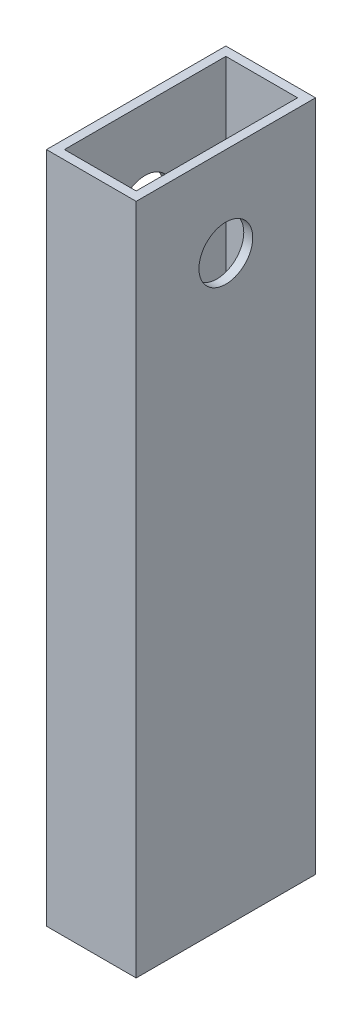
ISO-10303-21;
HEADER;
FILE_DESCRIPTION(('STEP AP214'),'2;1');
FILE_NAME('part.step','',(''),(''),'','','');
FILE_SCHEMA(('AUTOMOTIVE_DESIGN { 1 0 10303 214 1 1 1 1 }'));
ENDSEC;
DATA;
#1=APPLICATION_CONTEXT('core data for automotive mechanical design processes');
#2=APPLICATION_PROTOCOL_DEFINITION('international standard','automotive_design',2000,#1);
#3=PRODUCT_CONTEXT('',#1,'mechanical');
#4=PRODUCT('Part','Part','',(#3));
#5=PRODUCT_RELATED_PRODUCT_CATEGORY('part','',(#4));
#6=PRODUCT_DEFINITION_FORMATION('','',#4);
#7=PRODUCT_DEFINITION_CONTEXT('part definition',#1,'design');
#8=PRODUCT_DEFINITION('design','',#6,#7);
#9=PRODUCT_DEFINITION_SHAPE('','',#8);
#10=(LENGTH_UNIT() NAMED_UNIT(*) SI_UNIT(.MILLI.,.METRE.));
#11=(NAMED_UNIT(*) PLANE_ANGLE_UNIT() SI_UNIT($,.RADIAN.));
#12=(NAMED_UNIT(*) SI_UNIT($,.STERADIAN.) SOLID_ANGLE_UNIT());
#13=UNCERTAINTY_MEASURE_WITH_UNIT(LENGTH_MEASURE(1.E-05),#10,'distance_accuracy_value','');
#14=(GEOMETRIC_REPRESENTATION_CONTEXT(3) GLOBAL_UNCERTAINTY_ASSIGNED_CONTEXT((#13)) GLOBAL_UNIT_ASSIGNED_CONTEXT((#10,
#11,#12)) REPRESENTATION_CONTEXT('',''));
#15=CARTESIAN_POINT('',(0.,0.,0.));
#16=DIRECTION('',(0.,0.,1.));
#17=DIRECTION('',(1.,0.,0.));
#18=AXIS2_PLACEMENT_3D('',#15,#16,#17);
#19=CARTESIAN_POINT('',(0.,75.,0.));
#20=DIRECTION('',(0.,-1.,0.));
#21=DIRECTION('',(0.,0.,-1.));
#22=AXIS2_PLACEMENT_3D('',#19,#20,#21);
#23=PLANE('',#22);
#24=DIRECTION('',(0.,0.,-1.));
#25=VECTOR('',#24,1.);
#26=CARTESIAN_POINT('',(5.,75.,10.));
#27=LINE('',#26,#25);
#28=CARTESIAN_POINT('',(5.,75.,10.));
#29=VERTEX_POINT('',#28);
#30=CARTESIAN_POINT('',(5.,75.,-9.99999999999999));
#31=VERTEX_POINT('',#30);
#32=EDGE_CURVE('E141',#29,#31,#27,.T.);
#33=ORIENTED_EDGE('',*,*,#32,.T.);
#34=DIRECTION('',(-1.,0.,0.));
#35=VECTOR('',#34,1.);
#36=CARTESIAN_POINT('',(-5.,75.,-9.99999999999999));
#37=LINE('',#36,#35);
#38=CARTESIAN_POINT('',(-5.,75.,-9.99999999999999));
#39=VERTEX_POINT('',#38);
#40=EDGE_CURVE('E144',#31,#39,#37,.T.);
#41=ORIENTED_EDGE('',*,*,#40,.T.);
#42=DIRECTION('',(0.,0.,1.));
#43=VECTOR('',#42,1.);
#44=CARTESIAN_POINT('',(-5.,75.,10.));
#45=LINE('',#44,#43);
#46=CARTESIAN_POINT('',(-5.,75.,10.));
#47=VERTEX_POINT('',#46);
#48=EDGE_CURVE('E147',#39,#47,#45,.T.);
#49=ORIENTED_EDGE('',*,*,#48,.T.);
#50=DIRECTION('',(1.,0.,0.));
#51=VECTOR('',#50,1.);
#52=CARTESIAN_POINT('',(-5.,75.,10.));
#53=LINE('',#52,#51);
#54=EDGE_CURVE('E149',#47,#29,#53,.T.);
#55=ORIENTED_EDGE('',*,*,#54,.T.);
#56=EDGE_LOOP('',(#33,#41,#49,#55));
#57=FACE_BOUND('',#56,.T.);
#58=DIRECTION('',(0.,0.,1.));
#59=VECTOR('',#58,1.);
#60=CARTESIAN_POINT('',(-4.,75.,9.00000000000001));
#61=LINE('',#60,#59);
#62=CARTESIAN_POINT('',(-4.,75.,-8.99999999999999));
#63=VERTEX_POINT('',#62);
#64=CARTESIAN_POINT('',(-4.,75.,9.00000000000001));
#65=VERTEX_POINT('',#64);
#66=EDGE_CURVE('E103',#63,#65,#61,.T.);
#67=ORIENTED_EDGE('',*,*,#66,.F.);
#68=DIRECTION('',(-1.,0.,0.));
#69=VECTOR('',#68,1.);
#70=CARTESIAN_POINT('',(-4.,75.,-8.99999999999999));
#71=LINE('',#70,#69);
#72=CARTESIAN_POINT('',(4.,75.,-8.99999999999999));
#73=VERTEX_POINT('',#72);
#74=EDGE_CURVE('E125',#73,#63,#71,.T.);
#75=ORIENTED_EDGE('',*,*,#74,.F.);
#76=DIRECTION('',(0.,0.,-1.));
#77=VECTOR('',#76,1.);
#78=CARTESIAN_POINT('',(4.,75.,9.00000000000001));
#79=LINE('',#78,#77);
#80=CARTESIAN_POINT('',(4.,75.,9.00000000000001));
#81=VERTEX_POINT('',#80);
#82=EDGE_CURVE('E123',#81,#73,#79,.T.);
#83=ORIENTED_EDGE('',*,*,#82,.F.);
#84=DIRECTION('',(1.,0.,0.));
#85=VECTOR('',#84,1.);
#86=CARTESIAN_POINT('',(-4.,75.,9.00000000000001));
#87=LINE('',#86,#85);
#88=EDGE_CURVE('E111',#65,#81,#87,.T.);
#89=ORIENTED_EDGE('',*,*,#88,.F.);
#90=EDGE_LOOP('',(#67,#75,#83,#89));
#91=FACE_BOUND('',#90,.T.);
#92=ADVANCED_FACE('F37',(#57,#91),#23,.F.);
#93=CARTESIAN_POINT('',(0.,0.,0.));
#94=DIRECTION('',(0.,-1.,0.));
#95=DIRECTION('',(0.,0.,-1.));
#96=AXIS2_PLACEMENT_3D('',#93,#94,#95);
#97=PLANE('',#96);
#98=DIRECTION('',(0.,0.,-1.));
#99=VECTOR('',#98,1.);
#100=CARTESIAN_POINT('',(5.,0.,10.));
#101=LINE('',#100,#99);
#102=CARTESIAN_POINT('',(5.,0.,10.));
#103=VERTEX_POINT('',#102);
#104=CARTESIAN_POINT('',(5.,0.,-9.99999999999999));
#105=VERTEX_POINT('',#104);
#106=EDGE_CURVE('E119',#103,#105,#101,.T.);
#107=ORIENTED_EDGE('',*,*,#106,.F.);
#108=DIRECTION('',(1.,0.,0.));
#109=VECTOR('',#108,1.);
#110=CARTESIAN_POINT('',(-5.,0.,10.));
#111=LINE('',#110,#109);
#112=CARTESIAN_POINT('',(-5.,0.,10.));
#113=VERTEX_POINT('',#112);
#114=EDGE_CURVE('E145',#113,#103,#111,.T.);
#115=ORIENTED_EDGE('',*,*,#114,.F.);
#116=DIRECTION('',(0.,0.,1.));
#117=VECTOR('',#116,1.);
#118=CARTESIAN_POINT('',(-5.,0.,10.));
#119=LINE('',#118,#117);
#120=CARTESIAN_POINT('',(-5.,0.,-9.99999999999999));
#121=VERTEX_POINT('',#120);
#122=EDGE_CURVE('E156',#121,#113,#119,.T.);
#123=ORIENTED_EDGE('',*,*,#122,.F.);
#124=DIRECTION('',(-1.,0.,0.));
#125=VECTOR('',#124,1.);
#126=CARTESIAN_POINT('',(-5.,0.,-9.99999999999999));
#127=LINE('',#126,#125);
#128=EDGE_CURVE('E154',#105,#121,#127,.T.);
#129=ORIENTED_EDGE('',*,*,#128,.F.);
#130=EDGE_LOOP('',(#107,#115,#123,#129));
#131=FACE_BOUND('',#130,.T.);
#132=DIRECTION('',(-1.,0.,0.));
#133=VECTOR('',#132,1.);
#134=CARTESIAN_POINT('',(-4.,0.,-8.99999999999999));
#135=LINE('',#134,#133);
#136=CARTESIAN_POINT('',(4.,0.,-8.99999999999999));
#137=VERTEX_POINT('',#136);
#138=CARTESIAN_POINT('',(-4.,0.,-8.99999999999999));
#139=VERTEX_POINT('',#138);
#140=EDGE_CURVE('E112',#137,#139,#135,.T.);
#141=ORIENTED_EDGE('',*,*,#140,.T.);
#142=DIRECTION('',(0.,0.,1.));
#143=VECTOR('',#142,1.);
#144=CARTESIAN_POINT('',(-4.,0.,9.00000000000001));
#145=LINE('',#144,#143);
#146=CARTESIAN_POINT('',(-4.,0.,9.00000000000001));
#147=VERTEX_POINT('',#146);
#148=EDGE_CURVE('E61',#139,#147,#145,.T.);
#149=ORIENTED_EDGE('',*,*,#148,.T.);
#150=DIRECTION('',(1.,0.,0.));
#151=VECTOR('',#150,1.);
#152=CARTESIAN_POINT('',(-4.,0.,9.00000000000001));
#153=LINE('',#152,#151);
#154=CARTESIAN_POINT('',(4.,0.,9.00000000000001));
#155=VERTEX_POINT('',#154);
#156=EDGE_CURVE('E118',#147,#155,#153,.T.);
#157=ORIENTED_EDGE('',*,*,#156,.T.);
#158=DIRECTION('',(0.,0.,-1.));
#159=VECTOR('',#158,1.);
#160=CARTESIAN_POINT('',(4.,0.,9.00000000000001));
#161=LINE('',#160,#159);
#162=EDGE_CURVE('E133',#155,#137,#161,.T.);
#163=ORIENTED_EDGE('',*,*,#162,.T.);
#164=EDGE_LOOP('',(#141,#149,#157,#163));
#165=FACE_BOUND('',#164,.T.);
#166=ADVANCED_FACE('F175',(#131,#165),#97,.T.);
#167=CARTESIAN_POINT('',(5.,75.,10.));
#168=DIRECTION('',(-1.,0.,0.));
#169=DIRECTION('',(0.,0.,1.));
#170=AXIS2_PLACEMENT_3D('',#167,#168,#169);
#171=PLANE('',#170);
#172=CARTESIAN_POINT('',(5.,65.,0.));
#173=DIRECTION('',(1.,0.,0.));
#174=DIRECTION('',(0.,0.,-1.));
#175=AXIS2_PLACEMENT_3D('',#172,#173,#174);
#176=CIRCLE('',#175,3.);
#177=CARTESIAN_POINT('',(5.,65.,-3.));
#178=VERTEX_POINT('',#177);
#179=EDGE_CURVE('E218',#178,#178,#176,.T.);
#180=ORIENTED_EDGE('',*,*,#179,.F.);
#181=EDGE_LOOP('',(#180));
#182=FACE_BOUND('',#181,.T.);
#183=ORIENTED_EDGE('',*,*,#106,.T.);
#184=DIRECTION('',(0.,-1.,0.));
#185=VECTOR('',#184,1.);
#186=CARTESIAN_POINT('',(5.,75.,-9.99999999999999));
#187=LINE('',#186,#185);
#188=EDGE_CURVE('E11',#31,#105,#187,.T.);
#189=ORIENTED_EDGE('',*,*,#188,.F.);
#190=ORIENTED_EDGE('',*,*,#32,.F.);
#191=DIRECTION('',(0.,-1.,0.));
#192=VECTOR('',#191,1.);
#193=CARTESIAN_POINT('',(5.,75.,10.));
#194=LINE('',#193,#192);
#195=EDGE_CURVE('E151',#29,#103,#194,.T.);
#196=ORIENTED_EDGE('',*,*,#195,.T.);
#197=EDGE_LOOP('',(#183,#189,#190,#196));
#198=FACE_BOUND('',#197,.T.);
#199=ADVANCED_FACE('F39',(#182,#198),#171,.F.);
#200=CARTESIAN_POINT('',(-5.,75.,-9.99999999999999));
#201=DIRECTION('',(0.,0.,1.));
#202=DIRECTION('',(1.,0.,0.));
#203=AXIS2_PLACEMENT_3D('',#200,#201,#202);
#204=PLANE('',#203);
#205=ORIENTED_EDGE('',*,*,#128,.T.);
#206=DIRECTION('',(0.,-1.,0.));
#207=VECTOR('',#206,1.);
#208=CARTESIAN_POINT('',(-5.,75.,-9.99999999999999));
#209=LINE('',#208,#207);
#210=EDGE_CURVE('E46',#39,#121,#209,.T.);
#211=ORIENTED_EDGE('',*,*,#210,.F.);
#212=ORIENTED_EDGE('',*,*,#40,.F.);
#213=ORIENTED_EDGE('',*,*,#188,.T.);
#214=EDGE_LOOP('',(#205,#211,#212,#213));
#215=FACE_BOUND('',#214,.T.);
#216=ADVANCED_FACE('F185',(#215),#204,.F.);
#217=CARTESIAN_POINT('',(-5.,75.,10.));
#218=DIRECTION('',(1.,0.,0.));
#219=DIRECTION('',(0.,0.,-1.));
#220=AXIS2_PLACEMENT_3D('',#217,#218,#219);
#221=PLANE('',#220);
#222=CARTESIAN_POINT('',(-5.,65.,0.));
#223=DIRECTION('',(1.,0.,0.));
#224=DIRECTION('',(0.,0.,-1.));
#225=AXIS2_PLACEMENT_3D('',#222,#223,#224);
#226=CIRCLE('',#225,3.);
#227=CARTESIAN_POINT('',(-5.,65.,-3.));
#228=VERTEX_POINT('',#227);
#229=EDGE_CURVE('E216',#228,#228,#226,.T.);
#230=ORIENTED_EDGE('',*,*,#229,.T.);
#231=EDGE_LOOP('',(#230));
#232=FACE_BOUND('',#231,.T.);
#233=ORIENTED_EDGE('',*,*,#122,.T.);
#234=DIRECTION('',(0.,-1.,0.));
#235=VECTOR('',#234,1.);
#236=CARTESIAN_POINT('',(-5.,75.,10.));
#237=LINE('',#236,#235);
#238=EDGE_CURVE('E161',#47,#113,#237,.T.);
#239=ORIENTED_EDGE('',*,*,#238,.F.);
#240=ORIENTED_EDGE('',*,*,#48,.F.);
#241=ORIENTED_EDGE('',*,*,#210,.T.);
#242=EDGE_LOOP('',(#233,#239,#240,#241));
#243=FACE_BOUND('',#242,.T.);
#244=ADVANCED_FACE('F169',(#232,#243),#221,.F.);
#245=CARTESIAN_POINT('',(-5.,75.,10.));
#246=DIRECTION('',(0.,0.,-1.));
#247=DIRECTION('',(-1.,0.,0.));
#248=AXIS2_PLACEMENT_3D('',#245,#246,#247);
#249=PLANE('',#248);
#250=ORIENTED_EDGE('',*,*,#114,.T.);
#251=ORIENTED_EDGE('',*,*,#195,.F.);
#252=ORIENTED_EDGE('',*,*,#54,.F.);
#253=ORIENTED_EDGE('',*,*,#238,.T.);
#254=EDGE_LOOP('',(#250,#251,#252,#253));
#255=FACE_BOUND('',#254,.T.);
#256=ADVANCED_FACE('F179',(#255),#249,.F.);
#257=CARTESIAN_POINT('',(-4.,75.,9.00000000000001));
#258=DIRECTION('',(1.,0.,0.));
#259=DIRECTION('',(0.,0.,-1.));
#260=AXIS2_PLACEMENT_3D('',#257,#258,#259);
#261=PLANE('',#260);
#262=CARTESIAN_POINT('',(-4.,65.,0.));
#263=DIRECTION('',(1.,0.,0.));
#264=DIRECTION('',(0.,0.,-1.));
#265=AXIS2_PLACEMENT_3D('',#262,#263,#264);
#266=CIRCLE('',#265,3.);
#267=CARTESIAN_POINT('',(-4.,65.,-3.));
#268=VERTEX_POINT('',#267);
#269=EDGE_CURVE('E131',#268,#268,#266,.T.);
#270=ORIENTED_EDGE('',*,*,#269,.F.);
#271=EDGE_LOOP('',(#270));
#272=FACE_BOUND('',#271,.T.);
#273=ORIENTED_EDGE('',*,*,#148,.F.);
#274=DIRECTION('',(0.,-1.,0.));
#275=VECTOR('',#274,1.);
#276=CARTESIAN_POINT('',(-4.,75.,-8.99999999999999));
#277=LINE('',#276,#275);
#278=EDGE_CURVE('E107',#63,#139,#277,.T.);
#279=ORIENTED_EDGE('',*,*,#278,.F.);
#280=ORIENTED_EDGE('',*,*,#66,.T.);
#281=DIRECTION('',(0.,-1.,0.));
#282=VECTOR('',#281,1.);
#283=CARTESIAN_POINT('',(-4.,75.,9.00000000000001));
#284=LINE('',#283,#282);
#285=EDGE_CURVE('E106',#65,#147,#284,.T.);
#286=ORIENTED_EDGE('',*,*,#285,.T.);
#287=EDGE_LOOP('',(#273,#279,#280,#286));
#288=FACE_BOUND('',#287,.T.);
#289=ADVANCED_FACE('F105',(#272,#288),#261,.T.);
#290=CARTESIAN_POINT('',(-4.,75.,9.00000000000001));
#291=DIRECTION('',(0.,0.,-1.));
#292=DIRECTION('',(-1.,0.,0.));
#293=AXIS2_PLACEMENT_3D('',#290,#291,#292);
#294=PLANE('',#293);
#295=ORIENTED_EDGE('',*,*,#156,.F.);
#296=ORIENTED_EDGE('',*,*,#285,.F.);
#297=ORIENTED_EDGE('',*,*,#88,.T.);
#298=DIRECTION('',(0.,-1.,0.));
#299=VECTOR('',#298,1.);
#300=CARTESIAN_POINT('',(4.,75.,9.00000000000001));
#301=LINE('',#300,#299);
#302=EDGE_CURVE('E120',#81,#155,#301,.T.);
#303=ORIENTED_EDGE('',*,*,#302,.T.);
#304=EDGE_LOOP('',(#295,#296,#297,#303));
#305=FACE_BOUND('',#304,.T.);
#306=ADVANCED_FACE('F115',(#305),#294,.T.);
#307=CARTESIAN_POINT('',(4.,75.,9.00000000000001));
#308=DIRECTION('',(-1.,0.,0.));
#309=DIRECTION('',(0.,0.,1.));
#310=AXIS2_PLACEMENT_3D('',#307,#308,#309);
#311=PLANE('',#310);
#312=CARTESIAN_POINT('',(4.,65.,0.));
#313=DIRECTION('',(-1.,0.,0.));
#314=DIRECTION('',(0.,0.,1.));
#315=AXIS2_PLACEMENT_3D('',#312,#313,#314);
#316=CIRCLE('',#315,3.);
#317=CARTESIAN_POINT('',(4.,65.,3.));
#318=VERTEX_POINT('',#317);
#319=EDGE_CURVE('E41',#318,#318,#316,.T.);
#320=ORIENTED_EDGE('',*,*,#319,.F.);
#321=EDGE_LOOP('',(#320));
#322=FACE_BOUND('',#321,.T.);
#323=ORIENTED_EDGE('',*,*,#162,.F.);
#324=ORIENTED_EDGE('',*,*,#302,.F.);
#325=ORIENTED_EDGE('',*,*,#82,.T.);
#326=DIRECTION('',(0.,-1.,0.));
#327=VECTOR('',#326,1.);
#328=CARTESIAN_POINT('',(4.,75.,-8.99999999999999));
#329=LINE('',#328,#327);
#330=EDGE_CURVE('E53',#73,#137,#329,.T.);
#331=ORIENTED_EDGE('',*,*,#330,.T.);
#332=EDGE_LOOP('',(#323,#324,#325,#331));
#333=FACE_BOUND('',#332,.T.);
#334=ADVANCED_FACE('F211',(#322,#333),#311,.T.);
#335=CARTESIAN_POINT('',(-4.,75.,-8.99999999999999));
#336=DIRECTION('',(0.,0.,1.));
#337=DIRECTION('',(1.,0.,0.));
#338=AXIS2_PLACEMENT_3D('',#335,#336,#337);
#339=PLANE('',#338);
#340=ORIENTED_EDGE('',*,*,#140,.F.);
#341=ORIENTED_EDGE('',*,*,#330,.F.);
#342=ORIENTED_EDGE('',*,*,#74,.T.);
#343=ORIENTED_EDGE('',*,*,#278,.T.);
#344=EDGE_LOOP('',(#340,#341,#342,#343));
#345=FACE_BOUND('',#344,.T.);
#346=ADVANCED_FACE('F231',(#345),#339,.T.);
#347=CARTESIAN_POINT('',(-5.,65.,0.));
#348=DIRECTION('',(1.,0.,0.));
#349=DIRECTION('',(0.,0.,-1.));
#350=AXIS2_PLACEMENT_3D('',#347,#348,#349);
#351=CYLINDRICAL_SURFACE('',#350,3.);
#352=ORIENTED_EDGE('',*,*,#319,.T.);
#353=EDGE_LOOP('',(#352));
#354=FACE_BOUND('',#353,.T.);
#355=ORIENTED_EDGE('',*,*,#179,.T.);
#356=EDGE_LOOP('',(#355));
#357=FACE_BOUND('',#356,.T.);
#358=ADVANCED_FACE('F226',(#354,#357),#351,.F.);
#359=ORIENTED_EDGE('',*,*,#269,.T.);
#360=EDGE_LOOP('',(#359));
#361=FACE_BOUND('',#360,.T.);
#362=ORIENTED_EDGE('',*,*,#229,.F.);
#363=EDGE_LOOP('',(#362));
#364=FACE_BOUND('',#363,.T.);
#365=ADVANCED_FACE('F224',(#361,#364),#351,.F.);
#366=CLOSED_SHELL('',(#92,#166,#199,#216,#244,#256,#289,#306,#334,#346,#358,#365));
#367=MANIFOLD_SOLID_BREP('B2',#366);
#368=ADVANCED_BREP_SHAPE_REPRESENTATION('',(#18,#367),#14);
#369=SHAPE_DEFINITION_REPRESENTATION(#9,#368);
ENDSEC;
END-ISO-10303-21;
